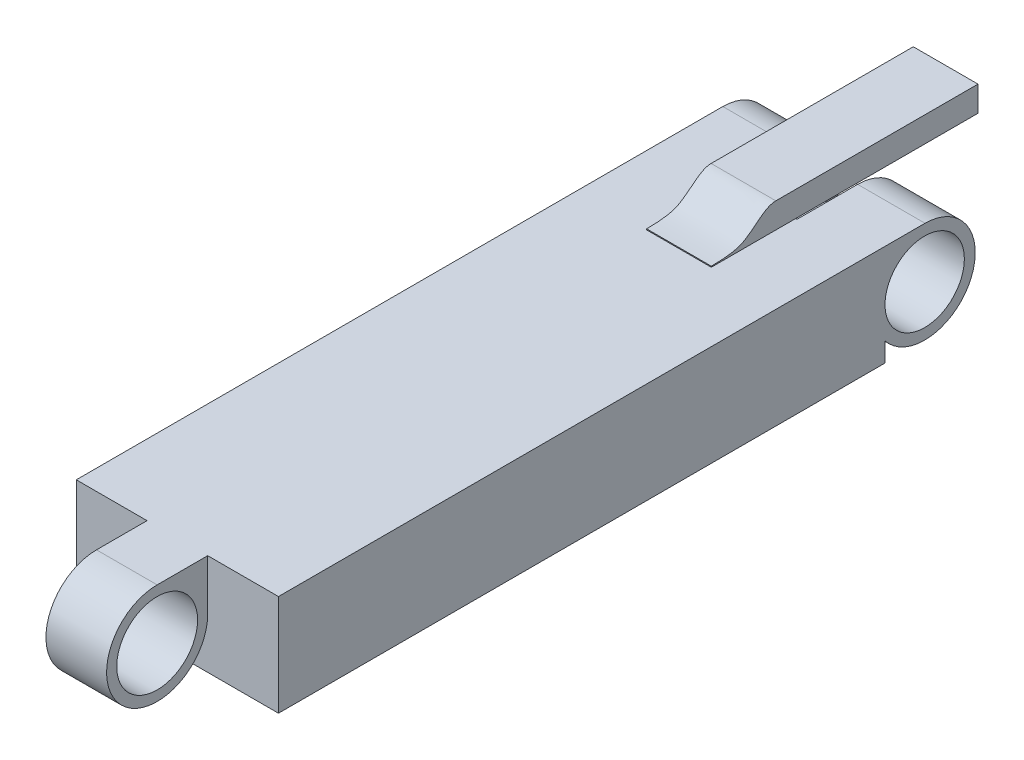
ISO-10303-21;
HEADER;
FILE_DESCRIPTION(('STEP AP214'),'2;1');
FILE_NAME('part.step','',(''),(''),'','','');
FILE_SCHEMA(('AUTOMOTIVE_DESIGN { 1 0 10303 214 1 1 1 1 }'));
ENDSEC;
DATA;
#1=APPLICATION_CONTEXT('core data for automotive mechanical design processes');
#2=APPLICATION_PROTOCOL_DEFINITION('international standard','automotive_design',2000,#1);
#3=PRODUCT_CONTEXT('',#1,'mechanical');
#4=PRODUCT('Part','Part','',(#3));
#5=PRODUCT_RELATED_PRODUCT_CATEGORY('part','',(#4));
#6=PRODUCT_DEFINITION_FORMATION('','',#4);
#7=PRODUCT_DEFINITION_CONTEXT('part definition',#1,'design');
#8=PRODUCT_DEFINITION('design','',#6,#7);
#9=PRODUCT_DEFINITION_SHAPE('','',#8);
#10=(LENGTH_UNIT() NAMED_UNIT(*) SI_UNIT(.MILLI.,.METRE.));
#11=(NAMED_UNIT(*) PLANE_ANGLE_UNIT() SI_UNIT($,.RADIAN.));
#12=(NAMED_UNIT(*) SI_UNIT($,.STERADIAN.) SOLID_ANGLE_UNIT());
#13=UNCERTAINTY_MEASURE_WITH_UNIT(LENGTH_MEASURE(1.E-05),#10,'distance_accuracy_value','');
#14=(GEOMETRIC_REPRESENTATION_CONTEXT(3) GLOBAL_UNCERTAINTY_ASSIGNED_CONTEXT((#13)) GLOBAL_UNIT_ASSIGNED_CONTEXT((#10,
#11,#12)) REPRESENTATION_CONTEXT('',''));
#15=CARTESIAN_POINT('',(0.,0.,0.));
#16=DIRECTION('',(0.,0.,1.));
#17=DIRECTION('',(1.,0.,0.));
#18=AXIS2_PLACEMENT_3D('',#15,#16,#17);
#19=CARTESIAN_POINT('',(10.,0.,0.));
#20=DIRECTION('',(0.,0.,1.));
#21=DIRECTION('',(1.,0.,0.));
#22=AXIS2_PLACEMENT_3D('',#19,#20,#21);
#23=PLANE('',#22);
#24=DIRECTION('',(1.,0.,0.));
#25=VECTOR('',#24,1.);
#26=CARTESIAN_POINT('',(3.5,2.5,0.));
#27=LINE('',#26,#25);
#28=CARTESIAN_POINT('',(3.5,2.5,0.));
#29=VERTEX_POINT('',#28);
#30=CARTESIAN_POINT('',(6.5,2.5,0.));
#31=VERTEX_POINT('',#30);
#32=EDGE_CURVE('E520',#29,#31,#27,.T.);
#33=ORIENTED_EDGE('',*,*,#32,.F.);
#34=DIRECTION('',(0.,1.,0.));
#35=VECTOR('',#34,1.);
#36=CARTESIAN_POINT('',(3.5,5.,0.));
#37=LINE('',#36,#35);
#38=CARTESIAN_POINT('',(3.5,5.,0.));
#39=VERTEX_POINT('',#38);
#40=EDGE_CURVE('E483',#29,#39,#37,.T.);
#41=ORIENTED_EDGE('',*,*,#40,.T.);
#42=DIRECTION('',(-1.,0.,0.));
#43=VECTOR('',#42,1.);
#44=CARTESIAN_POINT('',(10.,5.,0.));
#45=LINE('',#44,#43);
#46=CARTESIAN_POINT('',(0.,5.,0.));
#47=VERTEX_POINT('',#46);
#48=EDGE_CURVE('E386',#39,#47,#45,.T.);
#49=ORIENTED_EDGE('',*,*,#48,.T.);
#50=DIRECTION('',(0.,1.,0.));
#51=VECTOR('',#50,1.);
#52=CARTESIAN_POINT('',(0.,0.,0.));
#53=LINE('',#52,#51);
#54=CARTESIAN_POINT('',(0.,0.,0.));
#55=VERTEX_POINT('',#54);
#56=EDGE_CURVE('E468',#55,#47,#53,.T.);
#57=ORIENTED_EDGE('',*,*,#56,.F.);
#58=DIRECTION('',(-1.,0.,0.));
#59=VECTOR('',#58,1.);
#60=CARTESIAN_POINT('',(10.,0.,0.));
#61=LINE('',#60,#59);
#62=CARTESIAN_POINT('',(10.,0.,0.));
#63=VERTEX_POINT('',#62);
#64=EDGE_CURVE('E476',#63,#55,#61,.T.);
#65=ORIENTED_EDGE('',*,*,#64,.F.);
#66=DIRECTION('',(0.,1.,0.));
#67=VECTOR('',#66,1.);
#68=CARTESIAN_POINT('',(10.,0.,0.));
#69=LINE('',#68,#67);
#70=CARTESIAN_POINT('',(10.,5.,0.));
#71=VERTEX_POINT('',#70);
#72=EDGE_CURVE('E456',#63,#71,#69,.T.);
#73=ORIENTED_EDGE('',*,*,#72,.T.);
#74=CARTESIAN_POINT('',(6.5,5.,0.));
#75=VERTEX_POINT('',#74);
#76=EDGE_CURVE('E383',#71,#75,#45,.T.);
#77=ORIENTED_EDGE('',*,*,#76,.T.);
#78=DIRECTION('',(0.,1.,0.));
#79=VECTOR('',#78,1.);
#80=CARTESIAN_POINT('',(6.5,5.,0.));
#81=LINE('',#80,#79);
#82=EDGE_CURVE('E497',#31,#75,#81,.T.);
#83=ORIENTED_EDGE('',*,*,#82,.F.);
#84=EDGE_LOOP('',(#33,#41,#49,#57,#65,#73,#77,#83));
#85=FACE_BOUND('',#84,.T.);
#86=ADVANCED_FACE('F47',(#85),#23,.T.);
#87=CARTESIAN_POINT('',(10.,2.5,-31.9626369026869));
#88=DIRECTION('',(-1.,0.,0.));
#89=DIRECTION('',(0.,0.,1.));
#90=AXIS2_PLACEMENT_3D('',#87,#88,#89);
#91=CYLINDRICAL_SURFACE('',#90,1.96263690268693);
#92=CARTESIAN_POINT('',(6.66666666666667,2.5,-31.9626369026869));
#93=DIRECTION('',(1.,0.,0.));
#94=DIRECTION('',(0.,0.,-1.));
#95=AXIS2_PLACEMENT_3D('',#92,#93,#94);
#96=CIRCLE('',#95,1.96263690268693);
#97=CARTESIAN_POINT('',(6.66666666666667,2.5,-33.9252738053739));
#98=VERTEX_POINT('',#97);
#99=EDGE_CURVE('E410',#98,#98,#96,.T.);
#100=ORIENTED_EDGE('',*,*,#99,.F.);
#101=EDGE_LOOP('',(#100));
#102=FACE_BOUND('',#101,.T.);
#103=CARTESIAN_POINT('',(10.,2.5,-31.9626369026869));
#104=DIRECTION('',(1.,0.,0.));
#105=DIRECTION('',(0.,0.,-1.));
#106=AXIS2_PLACEMENT_3D('',#103,#104,#105);
#107=CIRCLE('',#106,1.96263690268693);
#108=CARTESIAN_POINT('',(10.,2.5,-33.9252738053739));
#109=VERTEX_POINT('',#108);
#110=EDGE_CURVE('E446',#109,#109,#107,.T.);
#111=ORIENTED_EDGE('',*,*,#110,.T.);
#112=EDGE_LOOP('',(#111));
#113=FACE_BOUND('',#112,.T.);
#114=ADVANCED_FACE('F335',(#102,#113),#91,.F.);
#115=CARTESIAN_POINT('',(10.,-0.208321197407538,-31.9449752607478));
#116=DIRECTION('',(0.,-0.00652111220123307,-0.999978737321779));
#117=DIRECTION('',(0.,0.999978737321779,-0.00652111220123307));
#118=AXIS2_PLACEMENT_3D('',#115,#116,#117);
#119=PLANE('',#118);
#120=DIRECTION('',(1.,0.,0.));
#121=VECTOR('',#120,1.);
#122=CARTESIAN_POINT('',(6.66666666666667,4.99994684330445,-31.97893968319));
#123=LINE('',#122,#121);
#124=CARTESIAN_POINT('',(3.33333333333333,4.99994684330445,-31.97893968319));
#125=VERTEX_POINT('',#124);
#126=CARTESIAN_POINT('',(6.66666666666667,4.99994684330445,-31.97893968319));
#127=VERTEX_POINT('',#126);
#128=EDGE_CURVE('E539',#125,#127,#123,.T.);
#129=ORIENTED_EDGE('',*,*,#128,.F.);
#130=DIRECTION('',(-1.,0.,0.));
#131=VECTOR('',#130,1.);
#132=CARTESIAN_POINT('',(3.33333333333333,4.99994684330445,-31.97893968319));
#133=LINE('',#132,#131);
#134=CARTESIAN_POINT('',(0.,4.99994684330445,-31.97893968319));
#135=VERTEX_POINT('',#134);
#136=EDGE_CURVE('E442',#135,#125,#133,.F.);
#137=ORIENTED_EDGE('',*,*,#136,.F.);
#138=DIRECTION('',(0.,-0.999978737321779,0.00652111220123306));
#139=VECTOR('',#138,1.);
#140=CARTESIAN_POINT('',(0.,-0.208321197407538,-31.9449752607478));
#141=LINE('',#140,#139);
#142=CARTESIAN_POINT('',(0.,5.,-31.9789400298382));
#143=VERTEX_POINT('',#142);
#144=EDGE_CURVE('E381',#143,#135,#141,.T.);
#145=ORIENTED_EDGE('',*,*,#144,.F.);
#146=DIRECTION('',(-1.,0.,0.));
#147=VECTOR('',#146,1.);
#148=CARTESIAN_POINT('',(10.,5.,-31.9789400298382));
#149=LINE('',#148,#147);
#150=CARTESIAN_POINT('',(3.4,5.,-31.9789400298382));
#151=VERTEX_POINT('',#150);
#152=EDGE_CURVE('E365',#151,#143,#149,.T.);
#153=ORIENTED_EDGE('',*,*,#152,.F.);
#154=DIRECTION('',(-1.,0.,0.));
#155=VECTOR('',#154,1.);
#156=CARTESIAN_POINT('',(10.,5.,-31.9789400298382));
#157=LINE('',#156,#155);
#158=CARTESIAN_POINT('',(6.6,5.,-31.9789400298382));
#159=VERTEX_POINT('',#158);
#160=EDGE_CURVE('E378',#159,#151,#157,.T.);
#161=ORIENTED_EDGE('',*,*,#160,.F.);
#162=CARTESIAN_POINT('',(10.,5.,-31.9789400298382));
#163=VERTEX_POINT('',#162);
#164=EDGE_CURVE('E382',#163,#159,#149,.T.);
#165=ORIENTED_EDGE('',*,*,#164,.F.);
#166=DIRECTION('',(0.,-0.999978737321779,0.00652111220123306));
#167=VECTOR('',#166,1.);
#168=CARTESIAN_POINT('',(10.,-0.208321197407538,-31.9449752607478));
#169=LINE('',#168,#167);
#170=CARTESIAN_POINT('',(10.,4.99994684330445,-31.97893968319));
#171=VERTEX_POINT('',#170);
#172=EDGE_CURVE('E451',#163,#171,#169,.T.);
#173=ORIENTED_EDGE('',*,*,#172,.T.);
#174=DIRECTION('',(1.,0.,0.));
#175=VECTOR('',#174,1.);
#176=CARTESIAN_POINT('',(6.66666666666667,4.99994684330445,-31.97893968319));
#177=LINE('',#176,#175);
#178=EDGE_CURVE('E428',#127,#171,#177,.T.);
#179=ORIENTED_EDGE('',*,*,#178,.F.);
#180=EDGE_LOOP('',(#129,#137,#145,#153,#161,#165,#173,#179));
#181=FACE_BOUND('',#180,.T.);
#182=ADVANCED_FACE('F49',(#181),#119,.T.);
#183=CARTESIAN_POINT('',(10.,5.,0.));
#184=DIRECTION('',(0.,1.,0.));
#185=DIRECTION('',(0.,0.,1.));
#186=AXIS2_PLACEMENT_3D('',#183,#184,#185);
#187=PLANE('',#186);
#188=DIRECTION('',(0.,0.,-1.));
#189=VECTOR('',#188,1.);
#190=CARTESIAN_POINT('',(3.4,5.,-24.8091377548968));
#191=LINE('',#190,#189);
#192=CARTESIAN_POINT('',(3.4,5.,-31.9707883796));
#193=VERTEX_POINT('',#192);
#194=EDGE_CURVE('E362',#193,#151,#191,.T.);
#195=ORIENTED_EDGE('',*,*,#194,.T.);
#196=ORIENTED_EDGE('',*,*,#152,.T.);
#197=DIRECTION('',(0.,0.,-1.));
#198=VECTOR('',#197,1.);
#199=CARTESIAN_POINT('',(0.,5.,0.));
#200=LINE('',#199,#198);
#201=EDGE_CURVE('E466',#47,#143,#200,.T.);
#202=ORIENTED_EDGE('',*,*,#201,.F.);
#203=ORIENTED_EDGE('',*,*,#48,.F.);
#204=DIRECTION('',(0.,0.,1.));
#205=VECTOR('',#204,1.);
#206=CARTESIAN_POINT('',(3.5,5.,2.5));
#207=LINE('',#206,#205);
#208=CARTESIAN_POINT('',(3.5,5.,2.5));
#209=VERTEX_POINT('',#208);
#210=EDGE_CURVE('E518',#39,#209,#207,.T.);
#211=ORIENTED_EDGE('',*,*,#210,.T.);
#212=DIRECTION('',(1.,0.,0.));
#213=VECTOR('',#212,1.);
#214=CARTESIAN_POINT('',(3.5,5.,2.5));
#215=LINE('',#214,#213);
#216=CARTESIAN_POINT('',(6.5,5.,2.5));
#217=VERTEX_POINT('',#216);
#218=EDGE_CURVE('E507',#209,#217,#215,.T.);
#219=ORIENTED_EDGE('',*,*,#218,.T.);
#220=DIRECTION('',(0.,0.,1.));
#221=VECTOR('',#220,1.);
#222=CARTESIAN_POINT('',(6.5,5.,2.5));
#223=LINE('',#222,#221);
#224=EDGE_CURVE('E503',#75,#217,#223,.T.);
#225=ORIENTED_EDGE('',*,*,#224,.F.);
#226=ORIENTED_EDGE('',*,*,#76,.F.);
#227=DIRECTION('',(0.,0.,-1.));
#228=VECTOR('',#227,1.);
#229=CARTESIAN_POINT('',(10.,5.,0.));
#230=LINE('',#229,#228);
#231=EDGE_CURVE('E453',#71,#163,#230,.T.);
#232=ORIENTED_EDGE('',*,*,#231,.T.);
#233=ORIENTED_EDGE('',*,*,#164,.T.);
#234=DIRECTION('',(0.,0.,-1.));
#235=VECTOR('',#234,1.);
#236=CARTESIAN_POINT('',(6.6,5.,-24.8091377548968));
#237=LINE('',#236,#235);
#238=CARTESIAN_POINT('',(6.6,5.,-31.9707883796));
#239=VERTEX_POINT('',#238);
#240=EDGE_CURVE('E561',#239,#159,#237,.T.);
#241=ORIENTED_EDGE('',*,*,#240,.F.);
#242=DIRECTION('',(-1.,0.,0.));
#243=VECTOR('',#242,1.);
#244=CARTESIAN_POINT('',(10.,5.,-31.9707883796));
#245=LINE('',#244,#243);
#246=CARTESIAN_POINT('',(6.66666666666667,5.,-31.9707883796));
#247=VERTEX_POINT('',#246);
#248=EDGE_CURVE('E11',#247,#239,#245,.T.);
#249=ORIENTED_EDGE('',*,*,#248,.F.);
#250=DIRECTION('',(0.,0.,-1.));
#251=VECTOR('',#250,1.);
#252=CARTESIAN_POINT('',(6.66666666666667,5.,0.));
#253=LINE('',#252,#251);
#254=CARTESIAN_POINT('',(6.66666666666667,5.,-28.9788762404472));
#255=VERTEX_POINT('',#254);
#256=EDGE_CURVE('E417',#255,#247,#253,.T.);
#257=ORIENTED_EDGE('',*,*,#256,.F.);
#258=DIRECTION('',(-1.,0.,0.));
#259=VECTOR('',#258,1.);
#260=CARTESIAN_POINT('',(10.,5.,-28.9788762404472));
#261=LINE('',#260,#259);
#262=CARTESIAN_POINT('',(6.6,5.,-28.9788762404472));
#263=VERTEX_POINT('',#262);
#264=EDGE_CURVE('E389',#255,#263,#261,.T.);
#265=ORIENTED_EDGE('',*,*,#264,.T.);
#266=CARTESIAN_POINT('',(6.6,5.,-24.8091377548968));
#267=VERTEX_POINT('',#266);
#268=EDGE_CURVE('E67',#267,#263,#237,.T.);
#269=ORIENTED_EDGE('',*,*,#268,.F.);
#270=DIRECTION('',(1.,0.,0.));
#271=VECTOR('',#270,1.);
#272=CARTESIAN_POINT('',(3.4,5.,-24.8091377548968));
#273=LINE('',#272,#271);
#274=CARTESIAN_POINT('',(3.4,5.,-24.8091377548968));
#275=VERTEX_POINT('',#274);
#276=EDGE_CURVE('E62',#275,#267,#273,.T.);
#277=ORIENTED_EDGE('',*,*,#276,.F.);
#278=CARTESIAN_POINT('',(3.4,5.,-28.9788762404472));
#279=VERTEX_POINT('',#278);
#280=EDGE_CURVE('E226',#275,#279,#191,.T.);
#281=ORIENTED_EDGE('',*,*,#280,.T.);
#282=CARTESIAN_POINT('',(3.33333333333333,5.,-28.9788762404472));
#283=VERTEX_POINT('',#282);
#284=EDGE_CURVE('E385',#279,#283,#261,.T.);
#285=ORIENTED_EDGE('',*,*,#284,.T.);
#286=DIRECTION('',(0.,0.,1.));
#287=VECTOR('',#286,1.);
#288=CARTESIAN_POINT('',(3.33333333333333,5.,0.));
#289=LINE('',#288,#287);
#290=CARTESIAN_POINT('',(3.33333333333333,4.99999999999997,-31.9707883796089));
#291=VERTEX_POINT('',#290);
#292=EDGE_CURVE('E396',#291,#283,#289,.T.);
#293=ORIENTED_EDGE('',*,*,#292,.F.);
#294=EDGE_CURVE('E55',#193,#291,#245,.T.);
#295=ORIENTED_EDGE('',*,*,#294,.F.);
#296=EDGE_LOOP('',(#195,#196,#202,#203,#211,#219,#225,#226,#232,#233,#241,#249,#257,#265,#269,
#277,#281,#285,#293,#295));
#297=FACE_BOUND('',#296,.T.);
#298=ADVANCED_FACE('F350',(#297),#187,.T.);
#299=CARTESIAN_POINT('',(10.,0.,0.));
#300=DIRECTION('',(0.,1.,0.));
#301=DIRECTION('',(0.,0.,1.));
#302=AXIS2_PLACEMENT_3D('',#299,#300,#301);
#303=PLANE('',#302);
#304=DIRECTION('',(-1.,0.,0.));
#305=VECTOR('',#304,1.);
#306=CARTESIAN_POINT('',(10.,0.,-29.9836551410445));
#307=LINE('',#306,#305);
#308=CARTESIAN_POINT('',(6.66666666666667,0.,-29.9836551410445));
#309=VERTEX_POINT('',#308);
#310=CARTESIAN_POINT('',(3.33333333333333,0.,-29.9836551410445));
#311=VERTEX_POINT('',#310);
#312=EDGE_CURVE('E534',#309,#311,#307,.T.);
#313=ORIENTED_EDGE('',*,*,#312,.T.);
#314=DIRECTION('',(0.,0.,1.));
#315=VECTOR('',#314,1.);
#316=CARTESIAN_POINT('',(3.33333333333333,0.,0.));
#317=LINE('',#316,#315);
#318=CARTESIAN_POINT('',(3.33333333333333,0.,-28.9462699861447));
#319=VERTEX_POINT('',#318);
#320=EDGE_CURVE('E537',#311,#319,#317,.T.);
#321=ORIENTED_EDGE('',*,*,#320,.T.);
#322=DIRECTION('',(1.,0.,0.));
#323=VECTOR('',#322,1.);
#324=CARTESIAN_POINT('',(10.,0.,-28.9462699861447));
#325=LINE('',#324,#323);
#326=CARTESIAN_POINT('',(6.66666666666667,0.,-28.9462699861447));
#327=VERTEX_POINT('',#326);
#328=EDGE_CURVE('E400',#319,#327,#325,.T.);
#329=ORIENTED_EDGE('',*,*,#328,.T.);
#330=DIRECTION('',(0.,0.,-1.));
#331=VECTOR('',#330,1.);
#332=CARTESIAN_POINT('',(6.66666666666667,0.,0.));
#333=LINE('',#332,#331);
#334=EDGE_CURVE('E531',#327,#309,#333,.T.);
#335=ORIENTED_EDGE('',*,*,#334,.T.);
#336=EDGE_LOOP('',(#313,#321,#329,#335));
#337=FACE_BOUND('',#336,.T.);
#338=DIRECTION('',(0.,0.,-1.));
#339=VECTOR('',#338,1.);
#340=CARTESIAN_POINT('',(0.,0.,0.));
#341=LINE('',#340,#339);
#342=CARTESIAN_POINT('',(0.,0.,-30.));
#343=VERTEX_POINT('',#342);
#344=EDGE_CURVE('E471',#55,#343,#341,.T.);
#345=ORIENTED_EDGE('',*,*,#344,.T.);
#346=DIRECTION('',(-1.,0.,0.));
#347=VECTOR('',#346,1.);
#348=CARTESIAN_POINT('',(10.,0.,-30.));
#349=LINE('',#348,#347);
#350=CARTESIAN_POINT('',(10.,0.,-30.));
#351=VERTEX_POINT('',#350);
#352=EDGE_CURVE('E464',#351,#343,#349,.T.);
#353=ORIENTED_EDGE('',*,*,#352,.F.);
#354=DIRECTION('',(0.,0.,-1.));
#355=VECTOR('',#354,1.);
#356=CARTESIAN_POINT('',(10.,0.,0.));
#357=LINE('',#356,#355);
#358=EDGE_CURVE('E459',#63,#351,#357,.T.);
#359=ORIENTED_EDGE('',*,*,#358,.F.);
#360=ORIENTED_EDGE('',*,*,#64,.T.);
#361=EDGE_LOOP('',(#345,#353,#359,#360));
#362=FACE_BOUND('',#361,.T.);
#363=ADVANCED_FACE('F346',(#337,#362),#303,.F.);
#364=CARTESIAN_POINT('',(10.,0.,-30.));
#365=DIRECTION('',(0.,0.,1.));
#366=DIRECTION('',(1.,0.,0.));
#367=AXIS2_PLACEMENT_3D('',#364,#365,#366);
#368=PLANE('',#367);
#369=DIRECTION('',(1.,0.,0.));
#370=VECTOR('',#369,1.);
#371=CARTESIAN_POINT('',(10.,0.0127456897646467,-30.));
#372=LINE('',#371,#370);
#373=CARTESIAN_POINT('',(3.33333333333333,0.0127456897646467,-30.));
#374=VERTEX_POINT('',#373);
#375=CARTESIAN_POINT('',(6.66666666666667,0.0127456897646467,-30.));
#376=VERTEX_POINT('',#375);
#377=EDGE_CURVE('E546',#374,#376,#372,.T.);
#378=ORIENTED_EDGE('',*,*,#377,.T.);
#379=DIRECTION('',(0.,1.,0.));
#380=VECTOR('',#379,1.);
#381=CARTESIAN_POINT('',(6.66666666666667,0.,-30.));
#382=LINE('',#381,#380);
#383=CARTESIAN_POINT('',(6.66666666666667,0.951434086578337,-30.));
#384=VERTEX_POINT('',#383);
#385=EDGE_CURVE('E552',#376,#384,#382,.T.);
#386=ORIENTED_EDGE('',*,*,#385,.T.);
#387=DIRECTION('',(1.,0.,0.));
#388=VECTOR('',#387,1.);
#389=CARTESIAN_POINT('',(6.66666666666667,0.951434086578337,-30.));
#390=LINE('',#389,#388);
#391=CARTESIAN_POINT('',(10.,0.951434086578337,-30.));
#392=VERTEX_POINT('',#391);
#393=EDGE_CURVE('E423',#384,#392,#390,.T.);
#394=ORIENTED_EDGE('',*,*,#393,.T.);
#395=DIRECTION('',(0.,1.,0.));
#396=VECTOR('',#395,1.);
#397=CARTESIAN_POINT('',(10.,0.,-30.));
#398=LINE('',#397,#396);
#399=EDGE_CURVE('E461',#351,#392,#398,.T.);
#400=ORIENTED_EDGE('',*,*,#399,.F.);
#401=ORIENTED_EDGE('',*,*,#352,.T.);
#402=DIRECTION('',(0.,1.,0.));
#403=VECTOR('',#402,1.);
#404=CARTESIAN_POINT('',(0.,0.,-30.));
#405=LINE('',#404,#403);
#406=CARTESIAN_POINT('',(0.,0.951434086578338,-30.));
#407=VERTEX_POINT('',#406);
#408=EDGE_CURVE('E454',#343,#407,#405,.T.);
#409=ORIENTED_EDGE('',*,*,#408,.T.);
#410=DIRECTION('',(-1.,0.,0.));
#411=VECTOR('',#410,1.);
#412=CARTESIAN_POINT('',(3.33333333333333,0.951434086578338,-30.));
#413=LINE('',#412,#411);
#414=CARTESIAN_POINT('',(3.33333333333333,0.951434086578338,-30.));
#415=VERTEX_POINT('',#414);
#416=EDGE_CURVE('E437',#407,#415,#413,.F.);
#417=ORIENTED_EDGE('',*,*,#416,.T.);
#418=DIRECTION('',(0.,-1.,0.));
#419=VECTOR('',#418,1.);
#420=CARTESIAN_POINT('',(3.33333333333333,0.,-30.));
#421=LINE('',#420,#419);
#422=EDGE_CURVE('E411',#415,#374,#421,.T.);
#423=ORIENTED_EDGE('',*,*,#422,.T.);
#424=EDGE_LOOP('',(#378,#386,#394,#400,#401,#409,#417,#423));
#425=FACE_BOUND('',#424,.T.);
#426=ADVANCED_FACE('F339',(#425),#368,.F.);
#427=CARTESIAN_POINT('',(10.,0.,0.));
#428=DIRECTION('',(1.,0.,0.));
#429=DIRECTION('',(0.,0.,-1.));
#430=AXIS2_PLACEMENT_3D('',#427,#428,#429);
#431=PLANE('',#430);
#432=ORIENTED_EDGE('',*,*,#110,.F.);
#433=EDGE_LOOP('',(#432));
#434=FACE_BOUND('',#433,.T.);
#435=ORIENTED_EDGE('',*,*,#399,.T.);
#436=CARTESIAN_POINT('',(10.,2.5,-31.9626369026869));
#437=DIRECTION('',(1.,0.,0.));
#438=DIRECTION('',(0.,0.,-1.));
#439=AXIS2_PLACEMENT_3D('',#436,#437,#438);
#440=CIRCLE('',#439,2.5);
#441=EDGE_CURVE('E414',#392,#171,#440,.T.);
#442=ORIENTED_EDGE('',*,*,#441,.T.);
#443=ORIENTED_EDGE('',*,*,#172,.F.);
#444=ORIENTED_EDGE('',*,*,#231,.F.);
#445=ORIENTED_EDGE('',*,*,#72,.F.);
#446=ORIENTED_EDGE('',*,*,#358,.T.);
#447=EDGE_LOOP('',(#435,#442,#443,#444,#445,#446));
#448=FACE_BOUND('',#447,.T.);
#449=ADVANCED_FACE('F336',(#434,#448),#431,.T.);
#450=CARTESIAN_POINT('',(0.,0.,0.));
#451=DIRECTION('',(1.,0.,0.));
#452=DIRECTION('',(0.,0.,-1.));
#453=AXIS2_PLACEMENT_3D('',#450,#451,#452);
#454=PLANE('',#453);
#455=ORIENTED_EDGE('',*,*,#144,.T.);
#456=CARTESIAN_POINT('',(0.,2.5,-31.9626369026869));
#457=DIRECTION('',(-1.,0.,0.));
#458=DIRECTION('',(0.,0.,1.));
#459=AXIS2_PLACEMENT_3D('',#456,#457,#458);
#460=CIRCLE('',#459,2.5);
#461=EDGE_CURVE('E434',#135,#407,#460,.T.);
#462=ORIENTED_EDGE('',*,*,#461,.T.);
#463=ORIENTED_EDGE('',*,*,#408,.F.);
#464=ORIENTED_EDGE('',*,*,#344,.F.);
#465=ORIENTED_EDGE('',*,*,#56,.T.);
#466=ORIENTED_EDGE('',*,*,#201,.T.);
#467=EDGE_LOOP('',(#455,#462,#463,#464,#465,#466));
#468=FACE_BOUND('',#467,.T.);
#469=CARTESIAN_POINT('',(0.,2.5,-31.9626369026869));
#470=DIRECTION('',(1.,0.,0.));
#471=DIRECTION('',(0.,0.,-1.));
#472=AXIS2_PLACEMENT_3D('',#469,#470,#471);
#473=CIRCLE('',#472,1.96263690268693);
#474=CARTESIAN_POINT('',(0.,2.5,-33.9252738053739));
#475=VERTEX_POINT('',#474);
#476=EDGE_CURVE('E445',#475,#475,#473,.T.);
#477=ORIENTED_EDGE('',*,*,#476,.T.);
#478=EDGE_LOOP('',(#477));
#479=FACE_BOUND('',#478,.T.);
#480=ADVANCED_FACE('F333',(#468,#479),#454,.F.);
#481=CARTESIAN_POINT('',(3.33333333333333,2.5,-31.9626369026869));
#482=DIRECTION('',(-1.,0.,0.));
#483=DIRECTION('',(0.,0.,1.));
#484=AXIS2_PLACEMENT_3D('',#481,#482,#483);
#485=CIRCLE('',#484,1.96263690268693);
#486=CARTESIAN_POINT('',(3.33333333333333,2.5,-30.));
#487=VERTEX_POINT('',#486);
#488=EDGE_CURVE('E431',#487,#487,#485,.T.);
#489=ORIENTED_EDGE('',*,*,#488,.F.);
#490=EDGE_LOOP('',(#489));
#491=FACE_BOUND('',#490,.T.);
#492=ORIENTED_EDGE('',*,*,#476,.F.);
#493=EDGE_LOOP('',(#492));
#494=FACE_BOUND('',#493,.T.);
#495=ADVANCED_FACE('F329',(#491,#494),#91,.F.);
#496=CARTESIAN_POINT('',(3.33333333333333,2.5,-31.9626369026869));
#497=DIRECTION('',(-1.,0.,0.));
#498=DIRECTION('',(0.,0.,1.));
#499=AXIS2_PLACEMENT_3D('',#496,#497,#498);
#500=CYLINDRICAL_SURFACE('',#499,2.5);
#501=ORIENTED_EDGE('',*,*,#461,.F.);
#502=ORIENTED_EDGE('',*,*,#136,.T.);
#503=CARTESIAN_POINT('',(3.33333333333333,2.5,-31.9626369026869));
#504=DIRECTION('',(-1.,0.,0.));
#505=DIRECTION('',(0.,0.,1.));
#506=AXIS2_PLACEMENT_3D('',#503,#504,#505);
#507=CIRCLE('',#506,2.5);
#508=EDGE_CURVE('E435',#125,#415,#507,.T.);
#509=ORIENTED_EDGE('',*,*,#508,.T.);
#510=ORIENTED_EDGE('',*,*,#416,.F.);
#511=EDGE_LOOP('',(#501,#502,#509,#510));
#512=FACE_BOUND('',#511,.T.);
#513=ADVANCED_FACE('F325',(#512),#500,.T.);
#514=CARTESIAN_POINT('',(3.33333333333333,2.5,-31.9626369026869));
#515=DIRECTION('',(-1.,0.,0.));
#516=DIRECTION('',(0.,0.,1.));
#517=AXIS2_PLACEMENT_3D('',#514,#515,#516);
#518=PLANE('',#517);
#519=ORIENTED_EDGE('',*,*,#422,.F.);
#520=ORIENTED_EDGE('',*,*,#508,.F.);
#521=DIRECTION('',(0.,-0.00652111220123307,-0.999978737321779));
#522=VECTOR('',#521,1.);
#523=CARTESIAN_POINT('',(3.33333333333333,5.01951017990815,-28.9790034712247));
#524=LINE('',#523,#522);
#525=EDGE_CURVE('E409',#291,#125,#524,.T.);
#526=ORIENTED_EDGE('',*,*,#525,.F.);
#527=ORIENTED_EDGE('',*,*,#292,.T.);
#528=DIRECTION('',(0.,0.999978737321779,-0.00652111220123263));
#529=VECTOR('',#528,1.);
#530=CARTESIAN_POINT('',(3.33333333333333,5.01951017990815,-28.9790034712247));
#531=LINE('',#530,#529);
#532=EDGE_CURVE('E398',#319,#283,#531,.T.);
#533=ORIENTED_EDGE('',*,*,#532,.F.);
#534=ORIENTED_EDGE('',*,*,#320,.F.);
#535=DIRECTION('',(0.,0.999978737321779,-0.00652111220123307));
#536=VECTOR('',#535,1.);
#537=CARTESIAN_POINT('',(3.33333333333333,-0.195522621954839,-29.9823800889778));
#538=LINE('',#537,#536);
#539=CARTESIAN_POINT('',(3.33333333333333,0.0128517321482529,-29.9837389504138));
#540=VERTEX_POINT('',#539);
#541=EDGE_CURVE('E527',#311,#540,#538,.T.);
#542=ORIENTED_EDGE('',*,*,#541,.T.);
#543=DIRECTION('',(0.,-0.00652111220123307,-0.999978737321779));
#544=VECTOR('',#543,1.);
#545=CARTESIAN_POINT('',(3.33333333333333,0.0196164932992501,-28.9463979102185));
#546=LINE('',#545,#544);
#547=EDGE_CURVE('E548',#540,#374,#546,.T.);
#548=ORIENTED_EDGE('',*,*,#547,.T.);
#549=EDGE_LOOP('',(#519,#520,#526,#527,#533,#534,#542,#548));
#550=FACE_BOUND('',#549,.T.);
#551=ORIENTED_EDGE('',*,*,#488,.T.);
#552=EDGE_LOOP('',(#551));
#553=FACE_BOUND('',#552,.T.);
#554=ADVANCED_FACE('F321',(#550,#553),#518,.F.);
#555=CARTESIAN_POINT('',(6.66666666666667,2.5,-31.9626369026869));
#556=DIRECTION('',(1.,0.,0.));
#557=DIRECTION('',(0.,0.,-1.));
#558=AXIS2_PLACEMENT_3D('',#555,#556,#557);
#559=CYLINDRICAL_SURFACE('',#558,2.5);
#560=CARTESIAN_POINT('',(6.66666666666667,2.5,-31.9626369026869));
#561=DIRECTION('',(1.,0.,0.));
#562=DIRECTION('',(0.,0.,-1.));
#563=AXIS2_PLACEMENT_3D('',#560,#561,#562);
#564=CIRCLE('',#563,2.5);
#565=EDGE_CURVE('E421',#384,#127,#564,.T.);
#566=ORIENTED_EDGE('',*,*,#565,.T.);
#567=ORIENTED_EDGE('',*,*,#178,.T.);
#568=ORIENTED_EDGE('',*,*,#441,.F.);
#569=ORIENTED_EDGE('',*,*,#393,.F.);
#570=EDGE_LOOP('',(#566,#567,#568,#569));
#571=FACE_BOUND('',#570,.T.);
#572=ADVANCED_FACE('F317',(#571),#559,.T.);
#573=CARTESIAN_POINT('',(6.66666666666667,2.5,-31.9626369026869));
#574=DIRECTION('',(1.,0.,0.));
#575=DIRECTION('',(0.,0.,-1.));
#576=AXIS2_PLACEMENT_3D('',#573,#574,#575);
#577=PLANE('',#576);
#578=ORIENTED_EDGE('',*,*,#99,.T.);
#579=EDGE_LOOP('',(#578));
#580=FACE_BOUND('',#579,.T.);
#581=DIRECTION('',(0.,-0.00652111220123307,-0.999978737321779));
#582=VECTOR('',#581,1.);
#583=CARTESIAN_POINT('',(6.66666666666667,5.01951017990815,-28.9790034712247));
#584=LINE('',#583,#582);
#585=EDGE_CURVE('E543',#247,#127,#584,.T.);
#586=ORIENTED_EDGE('',*,*,#585,.T.);
#587=ORIENTED_EDGE('',*,*,#565,.F.);
#588=ORIENTED_EDGE('',*,*,#385,.F.);
#589=DIRECTION('',(0.,-0.00652111220123307,-0.999978737321779));
#590=VECTOR('',#589,1.);
#591=CARTESIAN_POINT('',(6.66666666666667,0.0196164932992501,-28.9463979102185));
#592=LINE('',#591,#590);
#593=CARTESIAN_POINT('',(6.66666666666667,0.0128517321482529,-29.9837389504138));
#594=VERTEX_POINT('',#593);
#595=EDGE_CURVE('E402',#594,#376,#592,.T.);
#596=ORIENTED_EDGE('',*,*,#595,.F.);
#597=DIRECTION('',(0.,0.999978737321779,-0.00652111220123307));
#598=VECTOR('',#597,1.);
#599=CARTESIAN_POINT('',(6.66666666666667,-0.195522621954839,-29.9823800889778));
#600=LINE('',#599,#598);
#601=EDGE_CURVE('E526',#309,#594,#600,.T.);
#602=ORIENTED_EDGE('',*,*,#601,.F.);
#603=ORIENTED_EDGE('',*,*,#334,.F.);
#604=DIRECTION('',(0.,-0.999978737321779,0.00652111220123263));
#605=VECTOR('',#604,1.);
#606=CARTESIAN_POINT('',(6.66666666666667,5.01951017990815,-28.9790034712247));
#607=LINE('',#606,#605);
#608=EDGE_CURVE('E403',#255,#327,#607,.T.);
#609=ORIENTED_EDGE('',*,*,#608,.F.);
#610=ORIENTED_EDGE('',*,*,#256,.T.);
#611=EDGE_LOOP('',(#586,#587,#588,#596,#602,#603,#609,#610));
#612=FACE_BOUND('',#611,.T.);
#613=ADVANCED_FACE('F313',(#580,#612),#577,.F.);
#614=CARTESIAN_POINT('',(6.66666666666667,0.0196164932992501,-28.9463979102185));
#615=DIRECTION('',(0.,-0.999978737321779,0.00652111220123307));
#616=DIRECTION('',(0.,-0.00652111220123307,-0.999978737321779));
#617=AXIS2_PLACEMENT_3D('',#614,#615,#616);
#618=PLANE('',#617);
#619=ORIENTED_EDGE('',*,*,#547,.F.);
#620=DIRECTION('',(-1.,0.,0.));
#621=VECTOR('',#620,1.);
#622=CARTESIAN_POINT('',(3.33333333333333,0.0128517321482529,-29.9837389504138));
#623=LINE('',#622,#621);
#624=EDGE_CURVE('E522',#594,#540,#623,.T.);
#625=ORIENTED_EDGE('',*,*,#624,.F.);
#626=ORIENTED_EDGE('',*,*,#595,.T.);
#627=ORIENTED_EDGE('',*,*,#377,.F.);
#628=EDGE_LOOP('',(#619,#625,#626,#627));
#629=FACE_BOUND('',#628,.T.);
#630=ADVANCED_FACE('F309',(#629),#618,.F.);
#631=CARTESIAN_POINT('',(6.66666666666667,5.01951017990815,-28.9790034712247));
#632=DIRECTION('',(0.,0.999978737321779,-0.00652111220123307));
#633=DIRECTION('',(0.,0.00652111220123307,0.999978737321779));
#634=AXIS2_PLACEMENT_3D('',#631,#632,#633);
#635=PLANE('',#634);
#636=ORIENTED_EDGE('',*,*,#248,.T.);
#637=DIRECTION('',(-1.,0.,0.));
#638=VECTOR('',#637,1.);
#639=CARTESIAN_POINT('',(6.66666666666667,5.,-31.9707883796));
#640=LINE('',#639,#638);
#641=EDGE_CURVE('E564',#239,#193,#640,.T.);
#642=ORIENTED_EDGE('',*,*,#641,.T.);
#643=ORIENTED_EDGE('',*,*,#294,.T.);
#644=ORIENTED_EDGE('',*,*,#525,.T.);
#645=ORIENTED_EDGE('',*,*,#128,.T.);
#646=ORIENTED_EDGE('',*,*,#585,.F.);
#647=EDGE_LOOP('',(#636,#642,#643,#644,#645,#646));
#648=FACE_BOUND('',#647,.T.);
#649=ADVANCED_FACE('F305',(#648),#635,.F.);
#650=CARTESIAN_POINT('',(0.,-0.188757860803825,-28.9450390487825));
#651=DIRECTION('',(0.,-0.00652111220123263,-0.999978737321779));
#652=DIRECTION('',(0.,0.999978737321779,-0.00652111220123263));
#653=AXIS2_PLACEMENT_3D('',#650,#651,#652);
#654=PLANE('',#653);
#655=ORIENTED_EDGE('',*,*,#608,.T.);
#656=ORIENTED_EDGE('',*,*,#328,.F.);
#657=ORIENTED_EDGE('',*,*,#532,.T.);
#658=ORIENTED_EDGE('',*,*,#284,.F.);
#659=EDGE_CURVE('E390',#263,#279,#261,.T.);
#660=ORIENTED_EDGE('',*,*,#659,.F.);
#661=ORIENTED_EDGE('',*,*,#264,.F.);
#662=EDGE_LOOP('',(#655,#656,#657,#658,#660,#661));
#663=FACE_BOUND('',#662,.T.);
#664=ADVANCED_FACE('F301',(#663),#654,.T.);
#665=CARTESIAN_POINT('',(3.33333333333333,-0.195522621954839,-29.9823800889778));
#666=DIRECTION('',(0.,-0.00652111220123307,-0.999978737321779));
#667=DIRECTION('',(0.,0.999978737321779,-0.00652111220123307));
#668=AXIS2_PLACEMENT_3D('',#665,#666,#667);
#669=PLANE('',#668);
#670=ORIENTED_EDGE('',*,*,#601,.T.);
#671=ORIENTED_EDGE('',*,*,#624,.T.);
#672=ORIENTED_EDGE('',*,*,#541,.F.);
#673=ORIENTED_EDGE('',*,*,#312,.F.);
#674=EDGE_LOOP('',(#670,#671,#672,#673));
#675=FACE_BOUND('',#674,.T.);
#676=ADVANCED_FACE('F297',(#675),#669,.F.);
#677=CARTESIAN_POINT('',(3.5,2.5,2.5));
#678=DIRECTION('',(1.,0.,0.));
#679=DIRECTION('',(0.,0.,-1.));
#680=AXIS2_PLACEMENT_3D('',#677,#678,#679);
#681=CYLINDRICAL_SURFACE('',#680,2.5);
#682=ORIENTED_EDGE('',*,*,#32,.T.);
#683=CARTESIAN_POINT('',(6.5,2.5,2.5));
#684=DIRECTION('',(1.,0.,0.));
#685=DIRECTION('',(0.,0.,-1.));
#686=AXIS2_PLACEMENT_3D('',#683,#684,#685);
#687=CIRCLE('',#686,2.5);
#688=EDGE_CURVE('E505',#217,#31,#687,.T.);
#689=ORIENTED_EDGE('',*,*,#688,.F.);
#690=ORIENTED_EDGE('',*,*,#218,.F.);
#691=CARTESIAN_POINT('',(3.5,2.5,2.5));
#692=DIRECTION('',(1.,0.,0.));
#693=DIRECTION('',(0.,0.,-1.));
#694=AXIS2_PLACEMENT_3D('',#691,#692,#693);
#695=CIRCLE('',#694,2.5);
#696=EDGE_CURVE('E511',#209,#29,#695,.T.);
#697=ORIENTED_EDGE('',*,*,#696,.T.);
#698=EDGE_LOOP('',(#682,#689,#690,#697));
#699=FACE_BOUND('',#698,.T.);
#700=ADVANCED_FACE('F293',(#699),#681,.T.);
#701=CARTESIAN_POINT('',(3.5,2.5,2.5));
#702=DIRECTION('',(1.,0.,0.));
#703=DIRECTION('',(0.,0.,-1.));
#704=AXIS2_PLACEMENT_3D('',#701,#702,#703);
#705=PLANE('',#704);
#706=CARTESIAN_POINT('',(3.5,2.5,2.5));
#707=DIRECTION('',(1.,0.,0.));
#708=DIRECTION('',(0.,0.,-1.));
#709=AXIS2_PLACEMENT_3D('',#706,#707,#708);
#710=CIRCLE('',#709,2.);
#711=CARTESIAN_POINT('',(3.5,2.5,0.5));
#712=VERTEX_POINT('',#711);
#713=EDGE_CURVE('E508',#712,#712,#710,.T.);
#714=ORIENTED_EDGE('',*,*,#713,.T.);
#715=EDGE_LOOP('',(#714));
#716=FACE_BOUND('',#715,.T.);
#717=ORIENTED_EDGE('',*,*,#696,.F.);
#718=ORIENTED_EDGE('',*,*,#210,.F.);
#719=ORIENTED_EDGE('',*,*,#40,.F.);
#720=EDGE_LOOP('',(#717,#718,#719));
#721=FACE_BOUND('',#720,.T.);
#722=ADVANCED_FACE('F289',(#716,#721),#705,.F.);
#723=CARTESIAN_POINT('',(3.5,2.5,2.5));
#724=DIRECTION('',(1.,0.,0.));
#725=DIRECTION('',(0.,0.,-1.));
#726=AXIS2_PLACEMENT_3D('',#723,#724,#725);
#727=CYLINDRICAL_SURFACE('',#726,2.);
#728=ORIENTED_EDGE('',*,*,#713,.F.);
#729=EDGE_LOOP('',(#728));
#730=FACE_BOUND('',#729,.T.);
#731=CARTESIAN_POINT('',(6.5,2.5,2.5));
#732=DIRECTION('',(1.,0.,0.));
#733=DIRECTION('',(0.,0.,-1.));
#734=AXIS2_PLACEMENT_3D('',#731,#732,#733);
#735=CIRCLE('',#734,2.);
#736=CARTESIAN_POINT('',(6.5,2.5,0.5));
#737=VERTEX_POINT('',#736);
#738=EDGE_CURVE('E567',#737,#737,#735,.T.);
#739=ORIENTED_EDGE('',*,*,#738,.T.);
#740=EDGE_LOOP('',(#739));
#741=FACE_BOUND('',#740,.T.);
#742=ADVANCED_FACE('F285',(#730,#741),#727,.F.);
#743=CARTESIAN_POINT('',(6.5,2.5,2.5));
#744=DIRECTION('',(1.,0.,0.));
#745=DIRECTION('',(0.,0.,-1.));
#746=AXIS2_PLACEMENT_3D('',#743,#744,#745);
#747=PLANE('',#746);
#748=ORIENTED_EDGE('',*,*,#688,.T.);
#749=ORIENTED_EDGE('',*,*,#82,.T.);
#750=ORIENTED_EDGE('',*,*,#224,.T.);
#751=EDGE_LOOP('',(#748,#749,#750));
#752=FACE_BOUND('',#751,.T.);
#753=ORIENTED_EDGE('',*,*,#738,.F.);
#754=EDGE_LOOP('',(#753));
#755=FACE_BOUND('',#754,.T.);
#756=ADVANCED_FACE('F282',(#752,#755),#747,.T.);
#757=CARTESIAN_POINT('',(3.4,5.,-28.));
#758=DIRECTION('',(0.,-1.,0.));
#759=DIRECTION('',(0.,0.,-1.));
#760=AXIS2_PLACEMENT_3D('',#757,#758,#759);
#761=PLANE('',#760);
#762=ORIENTED_EDGE('',*,*,#641,.F.);
#763=EDGE_CURVE('E252',#263,#239,#237,.T.);
#764=ORIENTED_EDGE('',*,*,#763,.F.);
#765=ORIENTED_EDGE('',*,*,#659,.T.);
#766=EDGE_CURVE('E372',#279,#193,#191,.T.);
#767=ORIENTED_EDGE('',*,*,#766,.T.);
#768=EDGE_LOOP('',(#762,#764,#765,#767));
#769=FACE_BOUND('',#768,.T.);
#770=ADVANCED_FACE('F281',(#769),#761,.T.);
#771=CARTESIAN_POINT('',(3.4,5.,-38.));
#772=DIRECTION('',(0.,0.,-1.));
#773=DIRECTION('',(-1.,0.,0.));
#774=AXIS2_PLACEMENT_3D('',#771,#772,#773);
#775=PLANE('',#774);
#776=DIRECTION('',(1.,0.,0.));
#777=VECTOR('',#776,1.);
#778=CARTESIAN_POINT('',(3.4,6.25,-38.));
#779=LINE('',#778,#777);
#780=CARTESIAN_POINT('',(3.4,6.25,-38.));
#781=VERTEX_POINT('',#780);
#782=CARTESIAN_POINT('',(6.6,6.25,-38.));
#783=VERTEX_POINT('',#782);
#784=EDGE_CURVE('E214',#781,#783,#779,.T.);
#785=ORIENTED_EDGE('',*,*,#784,.T.);
#786=DIRECTION('',(0.,1.,0.));
#787=VECTOR('',#786,1.);
#788=CARTESIAN_POINT('',(6.6,5.,-38.));
#789=LINE('',#788,#787);
#790=CARTESIAN_POINT('',(6.6,5.,-38.));
#791=VERTEX_POINT('',#790);
#792=EDGE_CURVE('E219',#791,#783,#789,.T.);
#793=ORIENTED_EDGE('',*,*,#792,.F.);
#794=DIRECTION('',(1.,0.,0.));
#795=VECTOR('',#794,1.);
#796=CARTESIAN_POINT('',(3.4,5.,-38.));
#797=LINE('',#796,#795);
#798=CARTESIAN_POINT('',(3.4,5.,-38.));
#799=VERTEX_POINT('',#798);
#800=EDGE_CURVE('E565',#799,#791,#797,.T.);
#801=ORIENTED_EDGE('',*,*,#800,.F.);
#802=DIRECTION('',(0.,1.,0.));
#803=VECTOR('',#802,1.);
#804=CARTESIAN_POINT('',(3.4,5.,-38.));
#805=LINE('',#804,#803);
#806=EDGE_CURVE('E221',#799,#781,#805,.T.);
#807=ORIENTED_EDGE('',*,*,#806,.T.);
#808=EDGE_LOOP('',(#785,#793,#801,#807));
#809=FACE_BOUND('',#808,.T.);
#810=ADVANCED_FACE('F216',(#809),#775,.T.);
#811=EDGE_CURVE('E238',#159,#791,#237,.T.);
#812=ORIENTED_EDGE('',*,*,#811,.F.);
#813=ORIENTED_EDGE('',*,*,#160,.T.);
#814=EDGE_CURVE('E373',#151,#799,#191,.T.);
#815=ORIENTED_EDGE('',*,*,#814,.T.);
#816=ORIENTED_EDGE('',*,*,#800,.T.);
#817=EDGE_LOOP('',(#812,#813,#815,#816));
#818=FACE_BOUND('',#817,.T.);
#819=ADVANCED_FACE('F280',(#818),#761,.T.);
#820=CARTESIAN_POINT('',(3.4,5.,-24.8091377548968));
#821=DIRECTION('',(0.,0.,1.));
#822=DIRECTION('',(1.,0.,0.));
#823=AXIS2_PLACEMENT_3D('',#820,#821,#822);
#824=PLANE('',#823);
#825=ORIENTED_EDGE('',*,*,#276,.T.);
#826=DIRECTION('',(0.,-1.,0.));
#827=VECTOR('',#826,1.);
#828=CARTESIAN_POINT('',(6.6,5.,-24.8091377548968));
#829=LINE('',#828,#827);
#830=CARTESIAN_POINT('',(6.6,5.04700236032107,-24.8091377548968));
#831=VERTEX_POINT('',#830);
#832=EDGE_CURVE('E245',#831,#267,#829,.T.);
#833=ORIENTED_EDGE('',*,*,#832,.F.);
#834=DIRECTION('',(1.,0.,0.));
#835=VECTOR('',#834,1.);
#836=CARTESIAN_POINT('',(3.4,5.04700236032107,-24.8091377548968));
#837=LINE('',#836,#835);
#838=CARTESIAN_POINT('',(3.4,5.04700236032107,-24.8091377548968));
#839=VERTEX_POINT('',#838);
#840=EDGE_CURVE('E576',#839,#831,#837,.T.);
#841=ORIENTED_EDGE('',*,*,#840,.F.);
#842=DIRECTION('',(0.,-1.,0.));
#843=VECTOR('',#842,1.);
#844=CARTESIAN_POINT('',(3.4,5.,-24.8091377548968));
#845=LINE('',#844,#843);
#846=EDGE_CURVE('E262',#839,#275,#845,.T.);
#847=ORIENTED_EDGE('',*,*,#846,.T.);
#848=EDGE_LOOP('',(#825,#833,#841,#847));
#849=FACE_BOUND('',#848,.T.);
#850=ADVANCED_FACE('F272',(#849),#824,.T.);
#851=CARTESIAN_POINT('',(3.4,6.25,-28.));
#852=CARTESIAN_POINT('',(3.4,6.25,-27.5701397819725));
#853=CARTESIAN_POINT('',(3.4,5.78741331585586,-27.1080347478325));
#854=CARTESIAN_POINT('',(3.4,5.32389494671609,-26.4447373854557));
#855=CARTESIAN_POINT('',(3.4,5.04700236032106,-26.1140002795334));
#856=CARTESIAN_POINT('',(3.4,5.04700236032107,-24.8091377548968));
#857=B_SPLINE_CURVE_WITH_KNOTS('',3,(#851,#852,#853,#854,#855,#856),.UNSPECIFIED.,.F.,.F.,(4,1,
1,4),(0.,0.435997525125602,0.535997525125602,1.),.UNSPECIFIED.);
#858=DIRECTION('',(1.,0.,0.));
#859=VECTOR('',#858,1.);
#860=SURFACE_OF_LINEAR_EXTRUSION('',#857,#859);
#861=ORIENTED_EDGE('',*,*,#840,.T.);
#862=CARTESIAN_POINT('',(6.6,6.25,-28.));
#863=CARTESIAN_POINT('',(6.6,6.25,-27.5701397819725));
#864=CARTESIAN_POINT('',(6.6,5.78741331585586,-27.1080347478325));
#865=CARTESIAN_POINT('',(6.6,5.32389494671609,-26.4447373854557));
#866=CARTESIAN_POINT('',(6.6,5.04700236032106,-26.1140002795334));
#867=CARTESIAN_POINT('',(6.6,5.04700236032107,-24.8091377548968));
#868=B_SPLINE_CURVE_WITH_KNOTS('',3,(#862,#863,#864,#865,#866,#867),.UNSPECIFIED.,.F.,.F.,(4,1,
1,4),(0.,0.435997525125602,0.535997525125602,1.),.UNSPECIFIED.);
#869=CARTESIAN_POINT('',(6.6,6.25,-28.));
#870=VERTEX_POINT('',#869);
#871=EDGE_CURVE('E234',#870,#831,#868,.T.);
#872=ORIENTED_EDGE('',*,*,#871,.F.);
#873=DIRECTION('',(1.,0.,0.));
#874=VECTOR('',#873,1.);
#875=CARTESIAN_POINT('',(3.4,6.25,-28.));
#876=LINE('',#875,#874);
#877=CARTESIAN_POINT('',(3.4,6.25,-28.));
#878=VERTEX_POINT('',#877);
#879=EDGE_CURVE('E225',#878,#870,#876,.T.);
#880=ORIENTED_EDGE('',*,*,#879,.F.);
#881=EDGE_CURVE('E256',#878,#839,#857,.T.);
#882=ORIENTED_EDGE('',*,*,#881,.T.);
#883=EDGE_LOOP('',(#861,#872,#880,#882));
#884=FACE_BOUND('',#883,.T.);
#885=ADVANCED_FACE('F268',(#884),#860,.T.);
#886=CARTESIAN_POINT('',(3.4,6.25,-28.));
#887=DIRECTION('',(0.,1.,0.));
#888=DIRECTION('',(0.,0.,1.));
#889=AXIS2_PLACEMENT_3D('',#886,#887,#888);
#890=PLANE('',#889);
#891=ORIENTED_EDGE('',*,*,#879,.T.);
#892=DIRECTION('',(0.,0.,1.));
#893=VECTOR('',#892,1.);
#894=CARTESIAN_POINT('',(6.6,6.25,-28.));
#895=LINE('',#894,#893);
#896=EDGE_CURVE('E229',#783,#870,#895,.T.);
#897=ORIENTED_EDGE('',*,*,#896,.F.);
#898=ORIENTED_EDGE('',*,*,#784,.F.);
#899=DIRECTION('',(0.,0.,1.));
#900=VECTOR('',#899,1.);
#901=CARTESIAN_POINT('',(3.4,6.25,-28.));
#902=LINE('',#901,#900);
#903=EDGE_CURVE('E254',#781,#878,#902,.T.);
#904=ORIENTED_EDGE('',*,*,#903,.T.);
#905=EDGE_LOOP('',(#891,#897,#898,#904));
#906=FACE_BOUND('',#905,.T.);
#907=ADVANCED_FACE('F230',(#906),#890,.T.);
#908=CARTESIAN_POINT('',(3.4,5.5428935358454,-26.7583409093556));
#909=DIRECTION('',(-1.,0.,0.));
#910=DIRECTION('',(0.,0.,1.));
#911=AXIS2_PLACEMENT_3D('',#908,#909,#910);
#912=PLANE('',#911);
#913=ORIENTED_EDGE('',*,*,#806,.F.);
#914=ORIENTED_EDGE('',*,*,#814,.F.);
#915=ORIENTED_EDGE('',*,*,#194,.F.);
#916=ORIENTED_EDGE('',*,*,#766,.F.);
#917=ORIENTED_EDGE('',*,*,#280,.F.);
#918=ORIENTED_EDGE('',*,*,#846,.F.);
#919=ORIENTED_EDGE('',*,*,#881,.F.);
#920=ORIENTED_EDGE('',*,*,#903,.F.);
#921=EDGE_LOOP('',(#913,#914,#915,#916,#917,#918,#919,#920));
#922=FACE_BOUND('',#921,.T.);
#923=ADVANCED_FACE('F277',(#922),#912,.T.);
#924=CARTESIAN_POINT('',(6.6,5.5428935358454,-26.7583409093556));
#925=DIRECTION('',(-1.,0.,0.));
#926=DIRECTION('',(0.,0.,1.));
#927=AXIS2_PLACEMENT_3D('',#924,#925,#926);
#928=PLANE('',#927);
#929=ORIENTED_EDGE('',*,*,#792,.T.);
#930=ORIENTED_EDGE('',*,*,#896,.T.);
#931=ORIENTED_EDGE('',*,*,#871,.T.);
#932=ORIENTED_EDGE('',*,*,#832,.T.);
#933=ORIENTED_EDGE('',*,*,#268,.T.);
#934=ORIENTED_EDGE('',*,*,#763,.T.);
#935=ORIENTED_EDGE('',*,*,#240,.T.);
#936=ORIENTED_EDGE('',*,*,#811,.T.);
#937=EDGE_LOOP('',(#929,#930,#931,#932,#933,#934,#935,#936));
#938=FACE_BOUND('',#937,.T.);
#939=ADVANCED_FACE('F236',(#938),#928,.F.);
#940=CLOSED_SHELL('',(#86,#114,#182,#298,#363,#426,#449,#480,#495,#513,#554,#572,#613,#630,#649,
#664,#676,#700,#722,#742,#756,#770,#810,#819,#850,#885,#907,#923,#939));
#941=MANIFOLD_SOLID_BREP('B2',#940);
#942=ADVANCED_BREP_SHAPE_REPRESENTATION('',(#18,#941),#14);
#943=SHAPE_DEFINITION_REPRESENTATION(#9,#942);
ENDSEC;
END-ISO-10303-21;
